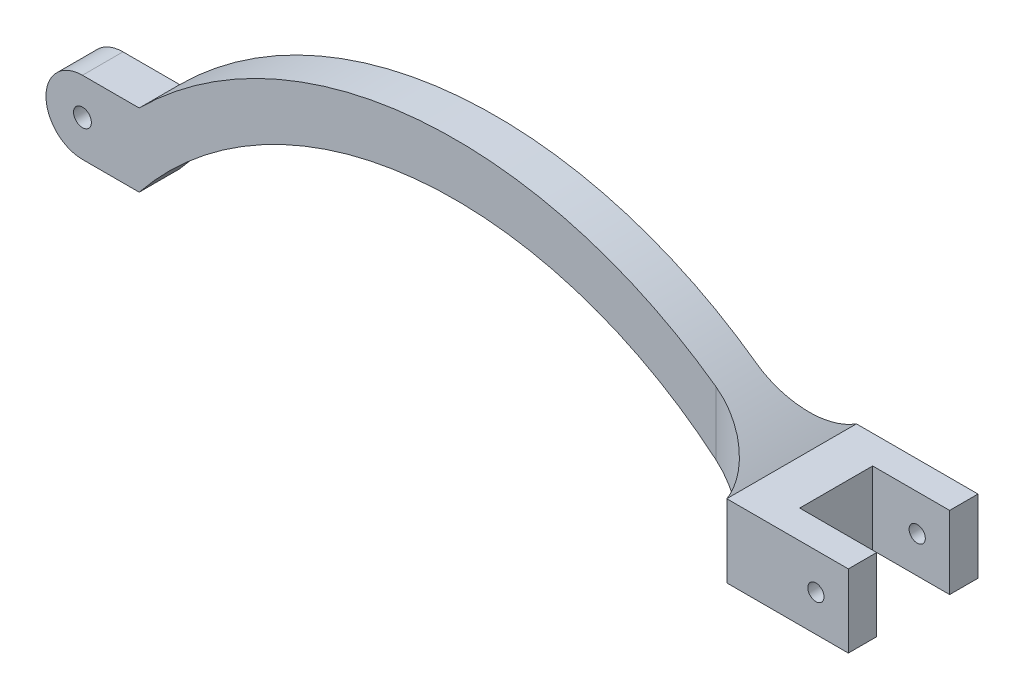
ISO-10303-21;
HEADER;
FILE_DESCRIPTION(('STEP AP214'),'2;1');
FILE_NAME('part.step','',(''),(''),'','','');
FILE_SCHEMA(('AUTOMOTIVE_DESIGN { 1 0 10303 214 1 1 1 1 }'));
ENDSEC;
DATA;
#1=APPLICATION_CONTEXT('core data for automotive mechanical design processes');
#2=APPLICATION_PROTOCOL_DEFINITION('international standard','automotive_design',2000,#1);
#3=PRODUCT_CONTEXT('',#1,'mechanical');
#4=PRODUCT('Part','Part','',(#3));
#5=PRODUCT_RELATED_PRODUCT_CATEGORY('part','',(#4));
#6=PRODUCT_DEFINITION_FORMATION('','',#4);
#7=PRODUCT_DEFINITION_CONTEXT('part definition',#1,'design');
#8=PRODUCT_DEFINITION('design','',#6,#7);
#9=PRODUCT_DEFINITION_SHAPE('','',#8);
#10=(LENGTH_UNIT() NAMED_UNIT(*) SI_UNIT(.MILLI.,.METRE.));
#11=(NAMED_UNIT(*) PLANE_ANGLE_UNIT() SI_UNIT($,.RADIAN.));
#12=(NAMED_UNIT(*) SI_UNIT($,.STERADIAN.) SOLID_ANGLE_UNIT());
#13=UNCERTAINTY_MEASURE_WITH_UNIT(LENGTH_MEASURE(1.E-05),#10,'distance_accuracy_value','');
#14=(GEOMETRIC_REPRESENTATION_CONTEXT(3) GLOBAL_UNCERTAINTY_ASSIGNED_CONTEXT((#13)) GLOBAL_UNIT_ASSIGNED_CONTEXT((#10,
#11,#12)) REPRESENTATION_CONTEXT('',''));
#15=CARTESIAN_POINT('',(0.,0.,0.));
#16=DIRECTION('',(0.,0.,1.));
#17=DIRECTION('',(1.,0.,0.));
#18=AXIS2_PLACEMENT_3D('',#15,#16,#17);
#19=CARTESIAN_POINT('',(96.,0.,10.5));
#20=DIRECTION('',(0.,0.,-1.));
#21=DIRECTION('',(-1.,0.,0.));
#22=AXIS2_PLACEMENT_3D('',#19,#20,#21);
#23=CYLINDRICAL_SURFACE('',#22,0.999999999999998);
#24=CARTESIAN_POINT('',(96.,0.,-2.));
#25=DIRECTION('',(0.,0.,-1.));
#26=DIRECTION('',(-1.,0.,0.));
#27=AXIS2_PLACEMENT_3D('',#24,#25,#26);
#28=CIRCLE('',#27,0.999999999999998);
#29=CARTESIAN_POINT('',(95.,0.,-2.));
#30=VERTEX_POINT('',#29);
#31=EDGE_CURVE('E188',#30,#30,#28,.T.);
#32=ORIENTED_EDGE('',*,*,#31,.F.);
#33=EDGE_LOOP('',(#32));
#34=FACE_BOUND('',#33,.T.);
#35=CARTESIAN_POINT('',(96.,0.,-4.5));
#36=DIRECTION('',(0.,0.,-1.));
#37=DIRECTION('',(-1.,0.,0.));
#38=AXIS2_PLACEMENT_3D('',#35,#36,#37);
#39=CIRCLE('',#38,0.999999999999998);
#40=CARTESIAN_POINT('',(95.,0.,-4.5));
#41=VERTEX_POINT('',#40);
#42=EDGE_CURVE('E259',#41,#41,#39,.F.);
#43=ORIENTED_EDGE('',*,*,#42,.F.);
#44=EDGE_LOOP('',(#43));
#45=FACE_BOUND('',#44,.T.);
#46=ADVANCED_FACE('F37',(#34,#45),#23,.F.);
#47=CARTESIAN_POINT('',(0.,-4.5,5.));
#48=DIRECTION('',(0.,1.,0.));
#49=DIRECTION('',(0.,0.,1.));
#50=AXIS2_PLACEMENT_3D('',#47,#48,#49);
#51=PLANE('',#50);
#52=DIRECTION('',(1.,0.,0.));
#53=VECTOR('',#52,1.);
#54=CARTESIAN_POINT('',(0.,-4.5,0.));
#55=LINE('',#54,#53);
#56=CARTESIAN_POINT('',(0.,-4.5,0.));
#57=VERTEX_POINT('',#56);
#58=CARTESIAN_POINT('',(7.00000000000001,-4.5,0.));
#59=VERTEX_POINT('',#58);
#60=EDGE_CURVE('E207',#57,#59,#55,.T.);
#61=ORIENTED_EDGE('',*,*,#60,.T.);
#62=DIRECTION('',(0.,0.,-1.));
#63=VECTOR('',#62,1.);
#64=CARTESIAN_POINT('',(7.00000000000001,-4.5,5.));
#65=LINE('',#64,#63);
#66=CARTESIAN_POINT('',(7.00000000000001,-4.5,5.));
#67=VERTEX_POINT('',#66);
#68=EDGE_CURVE('E253',#67,#59,#65,.T.);
#69=ORIENTED_EDGE('',*,*,#68,.F.);
#70=DIRECTION('',(1.,0.,0.));
#71=VECTOR('',#70,1.);
#72=CARTESIAN_POINT('',(0.,-4.5,5.));
#73=LINE('',#72,#71);
#74=CARTESIAN_POINT('',(0.,-4.5,5.));
#75=VERTEX_POINT('',#74);
#76=EDGE_CURVE('E208',#75,#67,#73,.T.);
#77=ORIENTED_EDGE('',*,*,#76,.F.);
#78=DIRECTION('',(0.,0.,-1.));
#79=VECTOR('',#78,1.);
#80=CARTESIAN_POINT('',(0.,-4.5,5.));
#81=LINE('',#80,#79);
#82=EDGE_CURVE('E226',#75,#57,#81,.T.);
#83=ORIENTED_EDGE('',*,*,#82,.T.);
#84=EDGE_LOOP('',(#61,#69,#77,#83));
#85=FACE_BOUND('',#84,.T.);
#86=ADVANCED_FACE('F301',(#85),#51,.F.);
#87=CARTESIAN_POINT('',(46.,-35.788975694324,5.));
#88=DIRECTION('',(0.,0.,-1.));
#89=DIRECTION('',(-1.,0.,0.));
#90=AXIS2_PLACEMENT_3D('',#87,#88,#89);
#91=CYLINDRICAL_SURFACE('',#90,50.);
#92=CARTESIAN_POINT('',(46.,-35.788975694324,0.));
#93=DIRECTION('',(0.,0.,1.));
#94=DIRECTION('',(1.,0.,0.));
#95=AXIS2_PLACEMENT_3D('',#92,#93,#94);
#96=CIRCLE('',#95,50.);
#97=CARTESIAN_POINT('',(78.1626028344113,2.49374859373986,0.));
#98=VERTEX_POINT('',#97);
#99=EDGE_CURVE('E229',#59,#98,#96,.F.);
#100=ORIENTED_EDGE('',*,*,#99,.T.);
#101=CARTESIAN_POINT('',(78.1626028344113,2.49374859373986,0.));
#102=CARTESIAN_POINT('',(78.4040447417338,2.29093359344259,-3.37569003215164E-05));
#103=CARTESIAN_POINT('',(78.6434820824053,2.08585007314274,-0.0124882911787474));
#104=CARTESIAN_POINT('',(79.1157106743964,1.67362998892704,-0.0611452866913375));
#105=CARTESIAN_POINT('',(79.3485322849237,1.46651207937057,-0.0972104133202924));
#106=CARTESIAN_POINT('',(79.8076910549101,1.05035191555778,-0.192015030019131));
#107=CARTESIAN_POINT('',(80.0340286240248,0.841309783979495,-0.250753084225604));
#108=CARTESIAN_POINT('',(80.4804873983901,0.421394388702881,-0.390741055970816));
#109=CARTESIAN_POINT('',(80.7005649507801,0.21051753553869,-0.4721195267503));
#110=CARTESIAN_POINT('',(80.9163173709813,0.,-0.564391539948746));
#111=B_SPLINE_CURVE_WITH_KNOTS('',3,(#101,#102,#103,#104,#105,#106,#107,#108,#109,#110),
.UNSPECIFIED.,.F.,.F.,(4,2,2,2,4),(0.,0.945599488364669,1.88574704644082,2.82583507528067,
3.77137390860521),.UNSPECIFIED.);
#112=CARTESIAN_POINT('',(80.9163173709812,0.,-0.564391539948744));
#113=VERTEX_POINT('',#112);
#114=EDGE_CURVE('E342',#98,#113,#111,.T.);
#115=ORIENTED_EDGE('',*,*,#114,.T.);
#116=DIRECTION('',(0.,0.,-1.));
#117=VECTOR('',#116,1.);
#118=CARTESIAN_POINT('',(80.9163173709812,0.,5.));
#119=LINE('',#118,#117);
#120=CARTESIAN_POINT('',(80.9163173709812,0.,5.56439153994874));
#121=VERTEX_POINT('',#120);
#122=EDGE_CURVE('E251',#121,#113,#119,.T.);
#123=ORIENTED_EDGE('',*,*,#122,.F.);
#124=CARTESIAN_POINT('',(80.9163173709813,0.,5.56439153994874));
#125=CARTESIAN_POINT('',(80.7005649507801,0.210517535538692,5.4721195267503));
#126=CARTESIAN_POINT('',(80.4804873983901,0.421394388702884,5.39074105597082));
#127=CARTESIAN_POINT('',(80.0340286240248,0.841309783979503,5.2507530842256));
#128=CARTESIAN_POINT('',(79.8076910549101,1.05035191555779,5.19201503001913));
#129=CARTESIAN_POINT('',(79.3485322849237,1.46651207937058,5.09721041332029));
#130=CARTESIAN_POINT('',(79.1157106743963,1.67362998892705,5.06114528669134));
#131=CARTESIAN_POINT('',(78.6434820824053,2.08585007314275,5.01248829117875));
#132=CARTESIAN_POINT('',(78.4040447417338,2.29093359344259,5.00003375690032));
#133=CARTESIAN_POINT('',(78.1626028344113,2.49374859373987,5.));
#134=B_SPLINE_CURVE_WITH_KNOTS('',3,(#124,#125,#126,#127,#128,#129,#130,#131,#132,#133),
.UNSPECIFIED.,.F.,.F.,(4,2,2,2,4),(0.,0.94553883332454,1.88562686216441,2.82577442024056,
3.77137390860522),.UNSPECIFIED.);
#135=CARTESIAN_POINT('',(78.1626028344113,2.49374859373986,5.));
#136=VERTEX_POINT('',#135);
#137=EDGE_CURVE('E276',#121,#136,#134,.T.);
#138=ORIENTED_EDGE('',*,*,#137,.T.);
#139=CARTESIAN_POINT('',(46.,-35.788975694324,5.));
#140=DIRECTION('',(0.,0.,1.));
#141=DIRECTION('',(1.,0.,0.));
#142=AXIS2_PLACEMENT_3D('',#139,#140,#141);
#143=CIRCLE('',#142,50.);
#144=EDGE_CURVE('E211',#67,#136,#143,.F.);
#145=ORIENTED_EDGE('',*,*,#144,.F.);
#146=ORIENTED_EDGE('',*,*,#68,.T.);
#147=EDGE_LOOP('',(#100,#115,#123,#138,#145,#146));
#148=FACE_BOUND('',#147,.T.);
#149=ADVANCED_FACE('F287',(#148),#91,.F.);
#150=CARTESIAN_POINT('',(0.,4.49999999999998,5.));
#151=DIRECTION('',(0.,-1.,0.));
#152=DIRECTION('',(1.,0.,0.));
#153=AXIS2_PLACEMENT_3D('',#150,#151,#152);
#154=PLANE('',#153);
#155=DIRECTION('',(0.,0.,-1.));
#156=VECTOR('',#155,1.);
#157=CARTESIAN_POINT('',(85.,4.5,5.));
#158=LINE('',#157,#156);
#159=CARTESIAN_POINT('',(85.,4.5,10.5));
#160=VERTEX_POINT('',#159);
#161=CARTESIAN_POINT('',(85.,4.5,-5.5));
#162=VERTEX_POINT('',#161);
#163=EDGE_CURVE('E248',#160,#162,#158,.T.);
#164=ORIENTED_EDGE('',*,*,#163,.F.);
#165=DIRECTION('',(1.,0.,0.));
#166=VECTOR('',#165,1.);
#167=CARTESIAN_POINT('',(0.,4.49999999999999,10.5));
#168=LINE('',#167,#166);
#169=CARTESIAN_POINT('',(100.,4.5,10.5));
#170=VERTEX_POINT('',#169);
#171=EDGE_CURVE('E171',#160,#170,#168,.T.);
#172=ORIENTED_EDGE('',*,*,#171,.T.);
#173=DIRECTION('',(0.,0.,1.));
#174=VECTOR('',#173,1.);
#175=CARTESIAN_POINT('',(100.,4.5,0.));
#176=LINE('',#175,#174);
#177=CARTESIAN_POINT('',(100.,4.5,7.));
#178=VERTEX_POINT('',#177);
#179=EDGE_CURVE('E168',#178,#170,#176,.T.);
#180=ORIENTED_EDGE('',*,*,#179,.F.);
#181=DIRECTION('',(1.,0.,0.));
#182=VECTOR('',#181,1.);
#183=CARTESIAN_POINT('',(0.,4.49999999999999,7.));
#184=LINE('',#183,#182);
#185=CARTESIAN_POINT('',(90.5,4.5,7.));
#186=VERTEX_POINT('',#185);
#187=EDGE_CURVE('E186',#186,#178,#184,.T.);
#188=ORIENTED_EDGE('',*,*,#187,.F.);
#189=DIRECTION('',(0.,0.,1.));
#190=VECTOR('',#189,1.);
#191=CARTESIAN_POINT('',(90.5,4.5,0.));
#192=LINE('',#191,#190);
#193=CARTESIAN_POINT('',(90.5,4.5,-2.));
#194=VERTEX_POINT('',#193);
#195=EDGE_CURVE('E158',#194,#186,#192,.T.);
#196=ORIENTED_EDGE('',*,*,#195,.F.);
#197=DIRECTION('',(-1.,0.,0.));
#198=VECTOR('',#197,1.);
#199=CARTESIAN_POINT('',(0.,4.49999999999999,-2.));
#200=LINE('',#199,#198);
#201=CARTESIAN_POINT('',(100.,4.5,-2.));
#202=VERTEX_POINT('',#201);
#203=EDGE_CURVE('E190',#202,#194,#200,.T.);
#204=ORIENTED_EDGE('',*,*,#203,.F.);
#205=CARTESIAN_POINT('',(100.,4.5,-5.5));
#206=VERTEX_POINT('',#205);
#207=EDGE_CURVE('E173',#206,#202,#176,.T.);
#208=ORIENTED_EDGE('',*,*,#207,.F.);
#209=DIRECTION('',(1.,0.,0.));
#210=VECTOR('',#209,1.);
#211=CARTESIAN_POINT('',(0.,4.49999999999999,-5.5));
#212=LINE('',#211,#210);
#213=EDGE_CURVE('E192',#162,#206,#212,.T.);
#214=ORIENTED_EDGE('',*,*,#213,.F.);
#215=EDGE_LOOP('',(#164,#172,#180,#188,#196,#204,#208,#214));
#216=FACE_BOUND('',#215,.T.);
#217=ADVANCED_FACE('F308',(#216),#154,.F.);
#218=CARTESIAN_POINT('',(46.,-34.5,5.));
#219=DIRECTION('',(0.,0.,-1.));
#220=DIRECTION('',(-1.,0.,0.));
#221=AXIS2_PLACEMENT_3D('',#218,#219,#220);
#222=CYLINDRICAL_SURFACE('',#221,55.1543289325507);
#223=CARTESIAN_POINT('',(46.,-34.5,0.));
#224=DIRECTION('',(0.,0.,1.));
#225=DIRECTION('',(1.,0.,0.));
#226=AXIS2_PLACEMENT_3D('',#223,#224,#225);
#227=CIRCLE('',#226,55.1543289325507);
#228=CARTESIAN_POINT('',(7.00000000000001,4.5,0.));
#229=VERTEX_POINT('',#228);
#230=CARTESIAN_POINT('',(78.1626028344113,10.305881075099,0.));
#231=VERTEX_POINT('',#230);
#232=EDGE_CURVE('E232',#229,#231,#227,.F.);
#233=ORIENTED_EDGE('',*,*,#232,.F.);
#234=DIRECTION('',(0.,0.,-1.));
#235=VECTOR('',#234,1.);
#236=CARTESIAN_POINT('',(7.00000000000001,4.5,5.));
#237=LINE('',#236,#235);
#238=CARTESIAN_POINT('',(7.00000000000001,4.5,5.));
#239=VERTEX_POINT('',#238);
#240=EDGE_CURVE('E246',#239,#229,#237,.T.);
#241=ORIENTED_EDGE('',*,*,#240,.F.);
#242=CARTESIAN_POINT('',(46.,-34.5,5.));
#243=DIRECTION('',(0.,0.,1.));
#244=DIRECTION('',(1.,0.,0.));
#245=AXIS2_PLACEMENT_3D('',#242,#243,#244);
#246=CIRCLE('',#245,55.1543289325507);
#247=CARTESIAN_POINT('',(78.1626028344113,10.305881075099,5.));
#248=VERTEX_POINT('',#247);
#249=EDGE_CURVE('E215',#239,#248,#246,.F.);
#250=ORIENTED_EDGE('',*,*,#249,.T.);
#251=CARTESIAN_POINT('',(78.1626028344113,10.305881075099,5.));
#252=CARTESIAN_POINT('',(78.4032917699453,10.1331361787883,5.00002354115578));
#253=CARTESIAN_POINT('',(78.6425178739514,9.95845050715863,5.01241272149615));
#254=CARTESIAN_POINT('',(79.1165204616564,9.60649107475287,5.06120498120833));
#255=CARTESIAN_POINT('',(79.3512977277413,9.42921777893642,5.0976037970874));
#256=CARTESIAN_POINT('',(79.8163029052874,9.07228752303167,5.19397570387641));
#257=CARTESIAN_POINT('',(80.0464967495238,8.89262271109455,5.25408360982541));
#258=CARTESIAN_POINT('',(80.4995931378775,8.53326207549391,5.39735330564491));
#259=CARTESIAN_POINT('',(80.7224952312399,8.35356625060091,5.48051651772762));
#260=CARTESIAN_POINT('',(81.1652254271049,7.99106774932452,5.67197540751179));
#261=CARTESIAN_POINT('',(81.3848315958845,7.80830211106357,5.78085586427921));
#262=CARTESIAN_POINT('',(81.8135042159154,7.44605669388574,6.02241990166447));
#263=CARTESIAN_POINT('',(82.0225690142645,7.26657743307011,6.15510720045258));
#264=CARTESIAN_POINT('',(82.4281587819804,6.91330019399892,6.44419587818067));
#265=CARTESIAN_POINT('',(82.624701568059,6.73949432344832,6.60056244424346));
#266=CARTESIAN_POINT('',(83.0034455099806,6.39999653094582,6.93734975467639));
#267=CARTESIAN_POINT('',(83.1856543713086,6.23430026786849,7.11775743279167));
#268=CARTESIAN_POINT('',(83.5852853393825,5.86632490257864,7.56061986952176));
#269=CARTESIAN_POINT('',(83.7970284976515,5.66785150555662,7.83150664240808));
#270=CARTESIAN_POINT('',(84.1844126176526,5.29977073644354,8.41399921481553));
#271=CARTESIAN_POINT('',(84.36020685813,5.1300413619276,8.72542245780095));
#272=CARTESIAN_POINT('',(84.6171969427952,4.87935027828686,9.27991652801378));
#273=CARTESIAN_POINT('',(84.7105768549081,4.78745812928862,9.51236150446208));
#274=CARTESIAN_POINT('',(84.8329848579923,4.66634534592738,9.87342976553271));
#275=CARTESIAN_POINT('',(84.8709335905132,4.62867166691417,9.99625191904255));
#276=CARTESIAN_POINT('',(84.940404806361,4.55953471265104,10.2455272137972));
#277=CARTESIAN_POINT('',(84.9719217481193,4.52807679357491,10.3719833799651));
#278=CARTESIAN_POINT('',(85.,4.49999999999999,10.5));
#279=B_SPLINE_CURVE_WITH_KNOTS('',3,(#251,#252,#253,#254,#255,#256,#257,#258,#259,#260,#261,
#262,#263,#264,#265,#266,#267,#268,#269,#270,#271,#272,#273,#274,#275,#276,#277,#278),
.UNSPECIFIED.,.F.,.F.,(4,2,2,2,2,2,2,2,2,2,2,2,2,4),(0.,0.888441852823517,1.77672598371723,
2.67013564042654,3.56360042114721,4.47976211395399,5.39606701832523,6.31103763493644,
7.22551298128206,8.41239752130906,9.59411076761138,10.392240908695,10.7937975583174,
11.1956987380002),.UNSPECIFIED.);
#280=EDGE_CURVE('E282',#248,#160,#279,.T.);
#281=ORIENTED_EDGE('',*,*,#280,.T.);
#282=ORIENTED_EDGE('',*,*,#163,.T.);
#283=CARTESIAN_POINT('',(85.,4.5,-5.5));
#284=CARTESIAN_POINT('',(84.9604863439153,4.53950899324124,-5.31974303788537));
#285=CARTESIAN_POINT('',(84.9141293066296,4.58575122903407,-5.1426194449336));
#286=CARTESIAN_POINT('',(84.8090504180455,4.69009008369175,-4.79606404431015));
#287=CARTESIAN_POINT('',(84.750352708691,4.74816355045552,-4.62661799251303));
#288=CARTESIAN_POINT('',(84.6224498727634,4.8740306601405,-4.29792956904559));
#289=CARTESIAN_POINT('',(84.5533657470896,4.94171192301869,-4.13859638776849));
#290=CARTESIAN_POINT('',(84.4053517809124,5.08585160057447,-3.82862828795918));
#291=CARTESIAN_POINT('',(84.3264160984289,5.16231522103367,-3.67799860879992));
#292=CARTESIAN_POINT('',(84.1410512677622,5.34068527427774,-3.35300526545564));
#293=CARTESIAN_POINT('',(84.032428891586,5.44444907589064,-3.1809088315703));
#294=CARTESIAN_POINT('',(83.8037809094952,5.66091455872421,-2.85060424345926));
#295=CARTESIAN_POINT('',(83.6837542215312,5.77361708788985,-2.69239740983439));
#296=CARTESIAN_POINT('',(83.3074066197262,6.12356885689035,-2.23695475782107));
#297=CARTESIAN_POINT('',(83.0357332171678,6.37177311364373,-1.96045755732458));
#298=CARTESIAN_POINT('',(82.564845074543,6.792534508242,-1.55211445260088));
#299=CARTESIAN_POINT('',(82.3747616357631,6.9601510212807,-1.4040314549387));
#300=CARTESIAN_POINT('',(81.9833070319966,7.30034320363346,-1.12979603553419));
#301=CARTESIAN_POINT('',(81.7819327306289,7.47292024433216,-1.00364974769323));
#302=CARTESIAN_POINT('',(81.3697417365462,7.8208471434996,-0.773448642306256));
#303=CARTESIAN_POINT('',(81.1589360944122,7.99619360882411,-0.669368750369157));
#304=CARTESIAN_POINT('',(80.7289936787138,8.34826884802009,-0.4832151456147));
#305=CARTESIAN_POINT('',(80.5098587077745,8.52499731629779,-0.401136701880049));
#306=CARTESIAN_POINT('',(80.1166802725102,8.83704613430145,-0.27589343914133));
#307=CARTESIAN_POINT('',(79.9440929443704,8.97237286238212,-0.228117046175425));
#308=CARTESIAN_POINT('',(79.5953610873829,9.24243178164265,-0.145856113079442));
#309=CARTESIAN_POINT('',(79.4192172273433,9.37716407890461,-0.111369097926634));
#310=CARTESIAN_POINT('',(79.0643038253387,9.64522755439649,-0.0560001035799074));
#311=CARTESIAN_POINT('',(78.8855401601569,9.77856097533998,-0.035091372780969));
#312=CARTESIAN_POINT('',(78.5256594174867,10.0435926234974,-0.00709299505664688));
#313=CARTESIAN_POINT('',(78.3445416978782,10.1752903845434,-7.2018054507414E-06));
#314=CARTESIAN_POINT('',(78.1626028344113,10.305881075099,0.));
#315=B_SPLINE_CURVE_WITH_KNOTS('',3,(#283,#284,#285,#286,#287,#288,#289,#290,#291,#292,#293,
#294,#295,#296,#297,#298,#299,#300,#301,#302,#303,#304,#305,#306,#307,#308,#309,#310,#311,#312,
#313,#314),.UNSPECIFIED.,.F.,.F.,(4,2,2,2,2,2,2,2,2,2,2,2,2,2,2,4),(0.,0.565671433900056,
1.13024637900701,1.68869159447304,2.24746955599413,2.93174071650262,3.61607686611286,
4.99072396447589,5.87041387582193,6.75034937026106,7.62927955672812,8.50802059711511,
9.18100488442554,9.85386377403962,10.5253929590473,11.1971093318402),.UNSPECIFIED.);
#316=EDGE_CURVE('E11',#162,#231,#315,.T.);
#317=ORIENTED_EDGE('',*,*,#316,.T.);
#318=EDGE_LOOP('',(#233,#241,#250,#281,#282,#317));
#319=FACE_BOUND('',#318,.T.);
#320=ADVANCED_FACE('F350',(#319),#222,.T.);
#321=CARTESIAN_POINT('',(0.,4.5,5.));
#322=DIRECTION('',(0.,1.,0.));
#323=DIRECTION('',(-1.,0.,0.));
#324=AXIS2_PLACEMENT_3D('',#321,#322,#323);
#325=PLANE('',#324);
#326=DIRECTION('',(1.,0.,0.));
#327=VECTOR('',#326,1.);
#328=CARTESIAN_POINT('',(0.,4.5,0.));
#329=LINE('',#328,#327);
#330=CARTESIAN_POINT('',(0.,4.5,0.));
#331=VERTEX_POINT('',#330);
#332=EDGE_CURVE('E235',#331,#229,#329,.T.);
#333=ORIENTED_EDGE('',*,*,#332,.F.);
#334=DIRECTION('',(0.,0.,-1.));
#335=VECTOR('',#334,1.);
#336=CARTESIAN_POINT('',(0.,4.5,5.));
#337=LINE('',#336,#335);
#338=CARTESIAN_POINT('',(0.,4.5,5.));
#339=VERTEX_POINT('',#338);
#340=EDGE_CURVE('E244',#339,#331,#337,.T.);
#341=ORIENTED_EDGE('',*,*,#340,.F.);
#342=DIRECTION('',(1.,0.,0.));
#343=VECTOR('',#342,1.);
#344=CARTESIAN_POINT('',(0.,4.5,5.));
#345=LINE('',#344,#343);
#346=EDGE_CURVE('E218',#339,#239,#345,.T.);
#347=ORIENTED_EDGE('',*,*,#346,.T.);
#348=ORIENTED_EDGE('',*,*,#240,.T.);
#349=EDGE_LOOP('',(#333,#341,#347,#348));
#350=FACE_BOUND('',#349,.T.);
#351=ADVANCED_FACE('F335',(#350),#325,.T.);
#352=CARTESIAN_POINT('',(0.,0.,5.));
#353=DIRECTION('',(0.,0.,-1.));
#354=DIRECTION('',(-1.,0.,0.));
#355=AXIS2_PLACEMENT_3D('',#352,#353,#354);
#356=CYLINDRICAL_SURFACE('',#355,4.5);
#357=CARTESIAN_POINT('',(0.,0.,0.));
#358=DIRECTION('',(0.,0.,1.));
#359=DIRECTION('',(1.,0.,0.));
#360=AXIS2_PLACEMENT_3D('',#357,#358,#359);
#361=CIRCLE('',#360,4.5);
#362=EDGE_CURVE('E238',#331,#57,#361,.T.);
#363=ORIENTED_EDGE('',*,*,#362,.T.);
#364=ORIENTED_EDGE('',*,*,#82,.F.);
#365=CARTESIAN_POINT('',(0.,0.,5.));
#366=DIRECTION('',(0.,0.,1.));
#367=DIRECTION('',(1.,0.,0.));
#368=AXIS2_PLACEMENT_3D('',#365,#366,#367);
#369=CIRCLE('',#368,4.5);
#370=EDGE_CURVE('E221',#339,#75,#369,.T.);
#371=ORIENTED_EDGE('',*,*,#370,.F.);
#372=ORIENTED_EDGE('',*,*,#340,.T.);
#373=EDGE_LOOP('',(#363,#364,#371,#372));
#374=FACE_BOUND('',#373,.T.);
#375=ADVANCED_FACE('F333',(#374),#356,.T.);
#376=CARTESIAN_POINT('',(0.,0.,5.));
#377=DIRECTION('',(0.,0.,-1.));
#378=DIRECTION('',(-1.,0.,0.));
#379=AXIS2_PLACEMENT_3D('',#376,#377,#378);
#380=CYLINDRICAL_SURFACE('',#379,1.1);
#381=CARTESIAN_POINT('',(0.,0.,5.));
#382=DIRECTION('',(0.,0.,1.));
#383=DIRECTION('',(1.,0.,0.));
#384=AXIS2_PLACEMENT_3D('',#381,#382,#383);
#385=CIRCLE('',#384,1.1);
#386=CARTESIAN_POINT('',(1.1,0.,5.));
#387=VERTEX_POINT('',#386);
#388=EDGE_CURVE('E223',#387,#387,#385,.T.);
#389=ORIENTED_EDGE('',*,*,#388,.T.);
#390=EDGE_LOOP('',(#389));
#391=FACE_BOUND('',#390,.T.);
#392=CARTESIAN_POINT('',(0.,0.,0.));
#393=DIRECTION('',(0.,0.,1.));
#394=DIRECTION('',(1.,0.,0.));
#395=AXIS2_PLACEMENT_3D('',#392,#393,#394);
#396=CIRCLE('',#395,1.1);
#397=CARTESIAN_POINT('',(1.1,0.,0.));
#398=VERTEX_POINT('',#397);
#399=EDGE_CURVE('E212',#398,#398,#396,.T.);
#400=ORIENTED_EDGE('',*,*,#399,.F.);
#401=EDGE_LOOP('',(#400));
#402=FACE_BOUND('',#401,.T.);
#403=ADVANCED_FACE('F406',(#391,#402),#380,.F.);
#404=CARTESIAN_POINT('',(0.,0.,5.));
#405=DIRECTION('',(0.,0.,1.));
#406=DIRECTION('',(1.,0.,0.));
#407=AXIS2_PLACEMENT_3D('',#404,#405,#406);
#408=PLANE('',#407);
#409=ORIENTED_EDGE('',*,*,#144,.T.);
#410=DIRECTION('',(0.,-1.,0.));
#411=VECTOR('',#410,1.);
#412=CARTESIAN_POINT('',(78.1626028344113,4.5,5.));
#413=LINE('',#412,#411);
#414=EDGE_CURVE('E268',#136,#248,#413,.F.);
#415=ORIENTED_EDGE('',*,*,#414,.T.);
#416=ORIENTED_EDGE('',*,*,#249,.F.);
#417=ORIENTED_EDGE('',*,*,#346,.F.);
#418=ORIENTED_EDGE('',*,*,#370,.T.);
#419=ORIENTED_EDGE('',*,*,#76,.T.);
#420=EDGE_LOOP('',(#409,#415,#416,#417,#418,#419));
#421=FACE_BOUND('',#420,.T.);
#422=ORIENTED_EDGE('',*,*,#388,.F.);
#423=EDGE_LOOP('',(#422));
#424=FACE_BOUND('',#423,.T.);
#425=ADVANCED_FACE('F327',(#421,#424),#408,.T.);
#426=CARTESIAN_POINT('',(0.,0.,0.));
#427=DIRECTION('',(0.,0.,1.));
#428=DIRECTION('',(1.,0.,0.));
#429=AXIS2_PLACEMENT_3D('',#426,#427,#428);
#430=PLANE('',#429);
#431=ORIENTED_EDGE('',*,*,#232,.T.);
#432=DIRECTION('',(0.,1.,0.));
#433=VECTOR('',#432,1.);
#434=CARTESIAN_POINT('',(78.1626028344113,0.,0.));
#435=LINE('',#434,#433);
#436=EDGE_CURVE('E270',#231,#98,#435,.F.);
#437=ORIENTED_EDGE('',*,*,#436,.T.);
#438=ORIENTED_EDGE('',*,*,#99,.F.);
#439=ORIENTED_EDGE('',*,*,#60,.F.);
#440=ORIENTED_EDGE('',*,*,#362,.F.);
#441=ORIENTED_EDGE('',*,*,#332,.T.);
#442=EDGE_LOOP('',(#431,#437,#438,#439,#440,#441));
#443=FACE_BOUND('',#442,.T.);
#444=ORIENTED_EDGE('',*,*,#399,.T.);
#445=EDGE_LOOP('',(#444));
#446=FACE_BOUND('',#445,.T.);
#447=ADVANCED_FACE('F319',(#443,#446),#430,.F.);
#448=CARTESIAN_POINT('',(90.,-4.5,0.));
#449=DIRECTION('',(0.,-1.,0.));
#450=DIRECTION('',(0.,0.,-1.));
#451=AXIS2_PLACEMENT_3D('',#448,#449,#450);
#452=PLANE('',#451);
#453=DIRECTION('',(1.,0.,0.));
#454=VECTOR('',#453,1.);
#455=CARTESIAN_POINT('',(0.,-4.50000000000001,10.5));
#456=LINE('',#455,#454);
#457=CARTESIAN_POINT('',(85.,-4.5,10.5));
#458=VERTEX_POINT('',#457);
#459=CARTESIAN_POINT('',(100.,-4.5,10.5));
#460=VERTEX_POINT('',#459);
#461=EDGE_CURVE('E183',#458,#460,#456,.T.);
#462=ORIENTED_EDGE('',*,*,#461,.F.);
#463=DIRECTION('',(0.,0.,1.));
#464=VECTOR('',#463,1.);
#465=CARTESIAN_POINT('',(85.,-4.5,0.));
#466=LINE('',#465,#464);
#467=CARTESIAN_POINT('',(85.,-4.5,-5.5));
#468=VERTEX_POINT('',#467);
#469=EDGE_CURVE('E58',#468,#458,#466,.T.);
#470=ORIENTED_EDGE('',*,*,#469,.F.);
#471=DIRECTION('',(1.,0.,0.));
#472=VECTOR('',#471,1.);
#473=CARTESIAN_POINT('',(0.,-4.50000000000001,-5.5));
#474=LINE('',#473,#472);
#475=CARTESIAN_POINT('',(100.,-4.5,-5.5));
#476=VERTEX_POINT('',#475);
#477=EDGE_CURVE('E181',#468,#476,#474,.T.);
#478=ORIENTED_EDGE('',*,*,#477,.T.);
#479=DIRECTION('',(0.,0.,1.));
#480=VECTOR('',#479,1.);
#481=CARTESIAN_POINT('',(100.,-4.5,0.));
#482=LINE('',#481,#480);
#483=CARTESIAN_POINT('',(100.,-4.5,-2.));
#484=VERTEX_POINT('',#483);
#485=EDGE_CURVE('E179',#476,#484,#482,.T.);
#486=ORIENTED_EDGE('',*,*,#485,.T.);
#487=DIRECTION('',(-1.,0.,0.));
#488=VECTOR('',#487,1.);
#489=CARTESIAN_POINT('',(0.,-4.50000000000001,-2.));
#490=LINE('',#489,#488);
#491=CARTESIAN_POINT('',(90.5,-4.5,-2.));
#492=VERTEX_POINT('',#491);
#493=EDGE_CURVE('E149',#484,#492,#490,.T.);
#494=ORIENTED_EDGE('',*,*,#493,.T.);
#495=DIRECTION('',(0.,0.,1.));
#496=VECTOR('',#495,1.);
#497=CARTESIAN_POINT('',(90.5,-4.5,0.));
#498=LINE('',#497,#496);
#499=CARTESIAN_POINT('',(90.5,-4.5,7.));
#500=VERTEX_POINT('',#499);
#501=EDGE_CURVE('E142',#492,#500,#498,.T.);
#502=ORIENTED_EDGE('',*,*,#501,.T.);
#503=DIRECTION('',(1.,0.,0.));
#504=VECTOR('',#503,1.);
#505=CARTESIAN_POINT('',(0.,-4.50000000000001,7.));
#506=LINE('',#505,#504);
#507=CARTESIAN_POINT('',(100.,-4.5,7.));
#508=VERTEX_POINT('',#507);
#509=EDGE_CURVE('E146',#500,#508,#506,.T.);
#510=ORIENTED_EDGE('',*,*,#509,.T.);
#511=EDGE_CURVE('E163',#508,#460,#482,.T.);
#512=ORIENTED_EDGE('',*,*,#511,.T.);
#513=EDGE_LOOP('',(#462,#470,#478,#486,#494,#502,#510,#512));
#514=FACE_BOUND('',#513,.T.);
#515=ADVANCED_FACE('F144',(#514),#452,.T.);
#516=CARTESIAN_POINT('',(85.,-4.5,0.));
#517=DIRECTION('',(-0.74053169909786,-0.672021430187488,0.));
#518=DIRECTION('',(0.672021430187488,-0.74053169909786,0.));
#519=AXIS2_PLACEMENT_3D('',#516,#517,#518);
#520=PLANE('',#519);
#521=ORIENTED_EDGE('',*,*,#469,.T.);
#522=CARTESIAN_POINT('',(78.1626028344113,3.03444624381644,12.));
#523=DIRECTION('',(-0.74053169909786,-0.672021430187488,0.));
#524=DIRECTION('',(-0.672021430187488,0.74053169909786,0.));
#525=AXIS2_PLACEMENT_3D('',#522,#523,#524);
#526=ELLIPSE('',#525,10.4163344880937,7.);
#527=EDGE_CURVE('E273',#458,#121,#526,.F.);
#528=ORIENTED_EDGE('',*,*,#527,.T.);
#529=ORIENTED_EDGE('',*,*,#122,.T.);
#530=CARTESIAN_POINT('',(78.1626028344113,3.03444624381644,-7.));
#531=DIRECTION('',(-0.74053169909786,-0.672021430187488,0.));
#532=DIRECTION('',(-0.672021430187488,0.74053169909786,0.));
#533=AXIS2_PLACEMENT_3D('',#530,#531,#532);
#534=ELLIPSE('',#533,10.4163344880937,7.);
#535=EDGE_CURVE('E51',#113,#468,#534,.F.);
#536=ORIENTED_EDGE('',*,*,#535,.T.);
#537=EDGE_LOOP('',(#521,#528,#529,#536));
#538=FACE_BOUND('',#537,.T.);
#539=ADVANCED_FACE('F397',(#538),#520,.T.);
#540=CARTESIAN_POINT('',(0.,-4.50000000000001,7.));
#541=DIRECTION('',(0.,0.,1.));
#542=DIRECTION('',(1.,0.,0.));
#543=AXIS2_PLACEMENT_3D('',#540,#541,#542);
#544=PLANE('',#543);
#545=CARTESIAN_POINT('',(96.,0.,7.));
#546=DIRECTION('',(0.,0.,1.));
#547=DIRECTION('',(1.,0.,0.));
#548=AXIS2_PLACEMENT_3D('',#545,#546,#547);
#549=CIRCLE('',#548,1.5);
#550=CARTESIAN_POINT('',(97.5,0.,7.));
#551=VERTEX_POINT('',#550);
#552=EDGE_CURVE('E256',#551,#551,#549,.T.);
#553=ORIENTED_EDGE('',*,*,#552,.T.);
#554=EDGE_LOOP('',(#553));
#555=FACE_BOUND('',#554,.T.);
#556=ORIENTED_EDGE('',*,*,#187,.T.);
#557=DIRECTION('',(0.,1.,0.));
#558=VECTOR('',#557,1.);
#559=CARTESIAN_POINT('',(100.,-4.5,7.));
#560=LINE('',#559,#558);
#561=EDGE_CURVE('E167',#508,#178,#560,.T.);
#562=ORIENTED_EDGE('',*,*,#561,.F.);
#563=ORIENTED_EDGE('',*,*,#509,.F.);
#564=DIRECTION('',(0.,1.,0.));
#565=VECTOR('',#564,1.);
#566=CARTESIAN_POINT('',(90.5,-4.5,7.));
#567=LINE('',#566,#565);
#568=EDGE_CURVE('E155',#500,#186,#567,.T.);
#569=ORIENTED_EDGE('',*,*,#568,.T.);
#570=EDGE_LOOP('',(#556,#562,#563,#569));
#571=FACE_BOUND('',#570,.T.);
#572=ADVANCED_FACE('F165',(#555,#571),#544,.F.);
#573=CARTESIAN_POINT('',(100.,-4.5,0.));
#574=DIRECTION('',(-1.,0.,0.));
#575=DIRECTION('',(0.,-1.,0.));
#576=AXIS2_PLACEMENT_3D('',#573,#574,#575);
#577=PLANE('',#576);
#578=ORIENTED_EDGE('',*,*,#179,.T.);
#579=DIRECTION('',(0.,1.,0.));
#580=VECTOR('',#579,1.);
#581=CARTESIAN_POINT('',(100.,-4.5,10.5));
#582=LINE('',#581,#580);
#583=EDGE_CURVE('E197',#460,#170,#582,.T.);
#584=ORIENTED_EDGE('',*,*,#583,.F.);
#585=ORIENTED_EDGE('',*,*,#511,.F.);
#586=ORIENTED_EDGE('',*,*,#561,.T.);
#587=EDGE_LOOP('',(#578,#584,#585,#586));
#588=FACE_BOUND('',#587,.T.);
#589=ADVANCED_FACE('F392',(#588),#577,.F.);
#590=CARTESIAN_POINT('',(0.,-4.50000000000001,10.5));
#591=DIRECTION('',(0.,0.,1.));
#592=DIRECTION('',(1.,0.,0.));
#593=AXIS2_PLACEMENT_3D('',#590,#591,#592);
#594=PLANE('',#593);
#595=CARTESIAN_POINT('',(96.,0.,10.5));
#596=DIRECTION('',(0.,0.,-1.));
#597=DIRECTION('',(-1.,0.,0.));
#598=AXIS2_PLACEMENT_3D('',#595,#596,#597);
#599=CIRCLE('',#598,0.999999999999998);
#600=CARTESIAN_POINT('',(95.,0.,10.5));
#601=VERTEX_POINT('',#600);
#602=EDGE_CURVE('E175',#601,#601,#599,.T.);
#603=ORIENTED_EDGE('',*,*,#602,.T.);
#604=EDGE_LOOP('',(#603));
#605=FACE_BOUND('',#604,.T.);
#606=ORIENTED_EDGE('',*,*,#171,.F.);
#607=DIRECTION('',(0.,-1.,0.));
#608=VECTOR('',#607,1.);
#609=CARTESIAN_POINT('',(85.,4.5,10.5));
#610=LINE('',#609,#608);
#611=EDGE_CURVE('E354',#160,#458,#610,.T.);
#612=ORIENTED_EDGE('',*,*,#611,.T.);
#613=ORIENTED_EDGE('',*,*,#461,.T.);
#614=ORIENTED_EDGE('',*,*,#583,.T.);
#615=EDGE_LOOP('',(#606,#612,#613,#614));
#616=FACE_BOUND('',#615,.T.);
#617=ADVANCED_FACE('F371',(#605,#616),#594,.T.);
#618=CARTESIAN_POINT('',(0.,-4.50000000000001,-5.5));
#619=DIRECTION('',(0.,0.,1.));
#620=DIRECTION('',(1.,0.,0.));
#621=AXIS2_PLACEMENT_3D('',#618,#619,#620);
#622=PLANE('',#621);
#623=CARTESIAN_POINT('',(96.,0.,-5.5));
#624=DIRECTION('',(0.,0.,-1.));
#625=DIRECTION('',(-1.,0.,0.));
#626=AXIS2_PLACEMENT_3D('',#623,#624,#625);
#627=CIRCLE('',#626,1.9);
#628=CARTESIAN_POINT('',(94.1,0.,-5.5));
#629=VERTEX_POINT('',#628);
#630=EDGE_CURVE('E359',#629,#629,#627,.T.);
#631=ORIENTED_EDGE('',*,*,#630,.F.);
#632=EDGE_LOOP('',(#631));
#633=FACE_BOUND('',#632,.T.);
#634=ORIENTED_EDGE('',*,*,#213,.T.);
#635=DIRECTION('',(0.,1.,0.));
#636=VECTOR('',#635,1.);
#637=CARTESIAN_POINT('',(100.,-4.5,-5.5));
#638=LINE('',#637,#636);
#639=EDGE_CURVE('E199',#476,#206,#638,.T.);
#640=ORIENTED_EDGE('',*,*,#639,.F.);
#641=ORIENTED_EDGE('',*,*,#477,.F.);
#642=DIRECTION('',(0.,-1.,0.));
#643=VECTOR('',#642,1.);
#644=CARTESIAN_POINT('',(85.,4.5,-5.5));
#645=LINE('',#644,#643);
#646=EDGE_CURVE('E357',#162,#468,#645,.T.);
#647=ORIENTED_EDGE('',*,*,#646,.F.);
#648=EDGE_LOOP('',(#634,#640,#641,#647));
#649=FACE_BOUND('',#648,.T.);
#650=ADVANCED_FACE('F367',(#633,#649),#622,.F.);
#651=ORIENTED_EDGE('',*,*,#207,.T.);
#652=DIRECTION('',(0.,1.,0.));
#653=VECTOR('',#652,1.);
#654=CARTESIAN_POINT('',(100.,-4.5,-2.));
#655=LINE('',#654,#653);
#656=EDGE_CURVE('E202',#484,#202,#655,.T.);
#657=ORIENTED_EDGE('',*,*,#656,.F.);
#658=ORIENTED_EDGE('',*,*,#485,.F.);
#659=ORIENTED_EDGE('',*,*,#639,.T.);
#660=EDGE_LOOP('',(#651,#657,#658,#659));
#661=FACE_BOUND('',#660,.T.);
#662=ADVANCED_FACE('F370',(#661),#577,.F.);
#663=CARTESIAN_POINT('',(0.,-4.50000000000001,-2.));
#664=DIRECTION('',(0.,0.,-1.));
#665=DIRECTION('',(-1.,0.,0.));
#666=AXIS2_PLACEMENT_3D('',#663,#664,#665);
#667=PLANE('',#666);
#668=ORIENTED_EDGE('',*,*,#31,.T.);
#669=EDGE_LOOP('',(#668));
#670=FACE_BOUND('',#669,.T.);
#671=ORIENTED_EDGE('',*,*,#203,.T.);
#672=DIRECTION('',(0.,1.,0.));
#673=VECTOR('',#672,1.);
#674=CARTESIAN_POINT('',(90.5,-4.5,-2.));
#675=LINE('',#674,#673);
#676=EDGE_CURVE('E162',#492,#194,#675,.T.);
#677=ORIENTED_EDGE('',*,*,#676,.F.);
#678=ORIENTED_EDGE('',*,*,#493,.F.);
#679=ORIENTED_EDGE('',*,*,#656,.T.);
#680=EDGE_LOOP('',(#671,#677,#678,#679));
#681=FACE_BOUND('',#680,.T.);
#682=ADVANCED_FACE('F382',(#670,#681),#667,.F.);
#683=CARTESIAN_POINT('',(90.5,-4.5,0.));
#684=DIRECTION('',(-1.,0.,0.));
#685=DIRECTION('',(0.,-1.,0.));
#686=AXIS2_PLACEMENT_3D('',#683,#684,#685);
#687=PLANE('',#686);
#688=ORIENTED_EDGE('',*,*,#195,.T.);
#689=ORIENTED_EDGE('',*,*,#568,.F.);
#690=ORIENTED_EDGE('',*,*,#501,.F.);
#691=ORIENTED_EDGE('',*,*,#676,.T.);
#692=EDGE_LOOP('',(#688,#689,#690,#691));
#693=FACE_BOUND('',#692,.T.);
#694=ADVANCED_FACE('F156',(#693),#687,.F.);
#695=CARTESIAN_POINT('',(96.,0.,7.5));
#696=DIRECTION('',(0.,0.,1.));
#697=DIRECTION('',(1.,0.,0.));
#698=AXIS2_PLACEMENT_3D('',#695,#696,#697);
#699=CIRCLE('',#698,0.999999999999998);
#700=CARTESIAN_POINT('',(97.,0.,7.5));
#701=VERTEX_POINT('',#700);
#702=EDGE_CURVE('E265',#701,#701,#699,.F.);
#703=ORIENTED_EDGE('',*,*,#702,.T.);
#704=EDGE_LOOP('',(#703));
#705=FACE_BOUND('',#704,.T.);
#706=ORIENTED_EDGE('',*,*,#602,.F.);
#707=EDGE_LOOP('',(#706));
#708=FACE_BOUND('',#707,.T.);
#709=ADVANCED_FACE('F312',(#705,#708),#23,.F.);
#710=CARTESIAN_POINT('',(96.,0.,-4.5));
#711=DIRECTION('',(0.,0.,-1.));
#712=DIRECTION('',(-1.,0.,0.));
#713=AXIS2_PLACEMENT_3D('',#710,#711,#712);
#714=PLANE('',#713);
#715=CARTESIAN_POINT('',(96.,0.,-4.5));
#716=DIRECTION('',(0.,0.,-1.));
#717=DIRECTION('',(-1.,0.,0.));
#718=AXIS2_PLACEMENT_3D('',#715,#716,#717);
#719=CIRCLE('',#718,1.9);
#720=CARTESIAN_POINT('',(94.1,0.,-4.5));
#721=VERTEX_POINT('',#720);
#722=EDGE_CURVE('E262',#721,#721,#719,.T.);
#723=ORIENTED_EDGE('',*,*,#722,.T.);
#724=EDGE_LOOP('',(#723));
#725=FACE_BOUND('',#724,.T.);
#726=ORIENTED_EDGE('',*,*,#42,.T.);
#727=EDGE_LOOP('',(#726));
#728=FACE_BOUND('',#727,.T.);
#729=ADVANCED_FACE('F507',(#725,#728),#714,.T.);
#730=CARTESIAN_POINT('',(96.,0.,-4.5));
#731=DIRECTION('',(0.,0.,-1.));
#732=DIRECTION('',(-1.,0.,0.));
#733=AXIS2_PLACEMENT_3D('',#730,#731,#732);
#734=CYLINDRICAL_SURFACE('',#733,1.9);
#735=ORIENTED_EDGE('',*,*,#722,.F.);
#736=EDGE_LOOP('',(#735));
#737=FACE_BOUND('',#736,.T.);
#738=ORIENTED_EDGE('',*,*,#630,.T.);
#739=EDGE_LOOP('',(#738));
#740=FACE_BOUND('',#739,.T.);
#741=ADVANCED_FACE('F299',(#737,#740),#734,.F.);
#742=CARTESIAN_POINT('',(96.,0.,7.5));
#743=DIRECTION('',(0.,0.,1.));
#744=DIRECTION('',(1.,0.,0.));
#745=AXIS2_PLACEMENT_3D('',#742,#743,#744);
#746=TOROIDAL_SURFACE('',#745,1.5,0.5);
#747=ORIENTED_EDGE('',*,*,#702,.F.);
#748=EDGE_LOOP('',(#747));
#749=FACE_BOUND('',#748,.T.);
#750=ORIENTED_EDGE('',*,*,#552,.F.);
#751=EDGE_LOOP('',(#750));
#752=FACE_BOUND('',#751,.T.);
#753=ADVANCED_FACE('F295',(#749,#752),#746,.T.);
#754=CARTESIAN_POINT('',(78.1626028344113,4.5,12.));
#755=DIRECTION('',(0.,1.,0.));
#756=DIRECTION('',(0.,0.,1.));
#757=AXIS2_PLACEMENT_3D('',#754,#755,#756);
#758=CYLINDRICAL_SURFACE('',#757,7.);
#759=ORIENTED_EDGE('',*,*,#280,.F.);
#760=ORIENTED_EDGE('',*,*,#414,.F.);
#761=ORIENTED_EDGE('',*,*,#137,.F.);
#762=ORIENTED_EDGE('',*,*,#527,.F.);
#763=ORIENTED_EDGE('',*,*,#611,.F.);
#764=EDGE_LOOP('',(#759,#760,#761,#762,#763));
#765=FACE_BOUND('',#764,.T.);
#766=ADVANCED_FACE('F291',(#765),#758,.F.);
#767=CARTESIAN_POINT('',(78.1626028344113,4.5,-7.));
#768=DIRECTION('',(0.,1.,0.));
#769=DIRECTION('',(0.,0.,1.));
#770=AXIS2_PLACEMENT_3D('',#767,#768,#769);
#771=CYLINDRICAL_SURFACE('',#770,7.);
#772=ORIENTED_EDGE('',*,*,#316,.F.);
#773=ORIENTED_EDGE('',*,*,#646,.T.);
#774=ORIENTED_EDGE('',*,*,#535,.F.);
#775=ORIENTED_EDGE('',*,*,#114,.F.);
#776=ORIENTED_EDGE('',*,*,#436,.F.);
#777=EDGE_LOOP('',(#772,#773,#774,#775,#776));
#778=FACE_BOUND('',#777,.T.);
#779=ADVANCED_FACE('F39',(#778),#771,.F.);
#780=CLOSED_SHELL('',(#46,#86,#149,#217,#320,#351,#375,#403,#425,#447,#515,#539,#572,#589,#617,
#650,#662,#682,#694,#709,#729,#741,#753,#766,#779));
#781=MANIFOLD_SOLID_BREP('B2',#780);
#782=ADVANCED_BREP_SHAPE_REPRESENTATION('',(#18,#781),#14);
#783=SHAPE_DEFINITION_REPRESENTATION(#9,#782);
ENDSEC;
END-ISO-10303-21;
